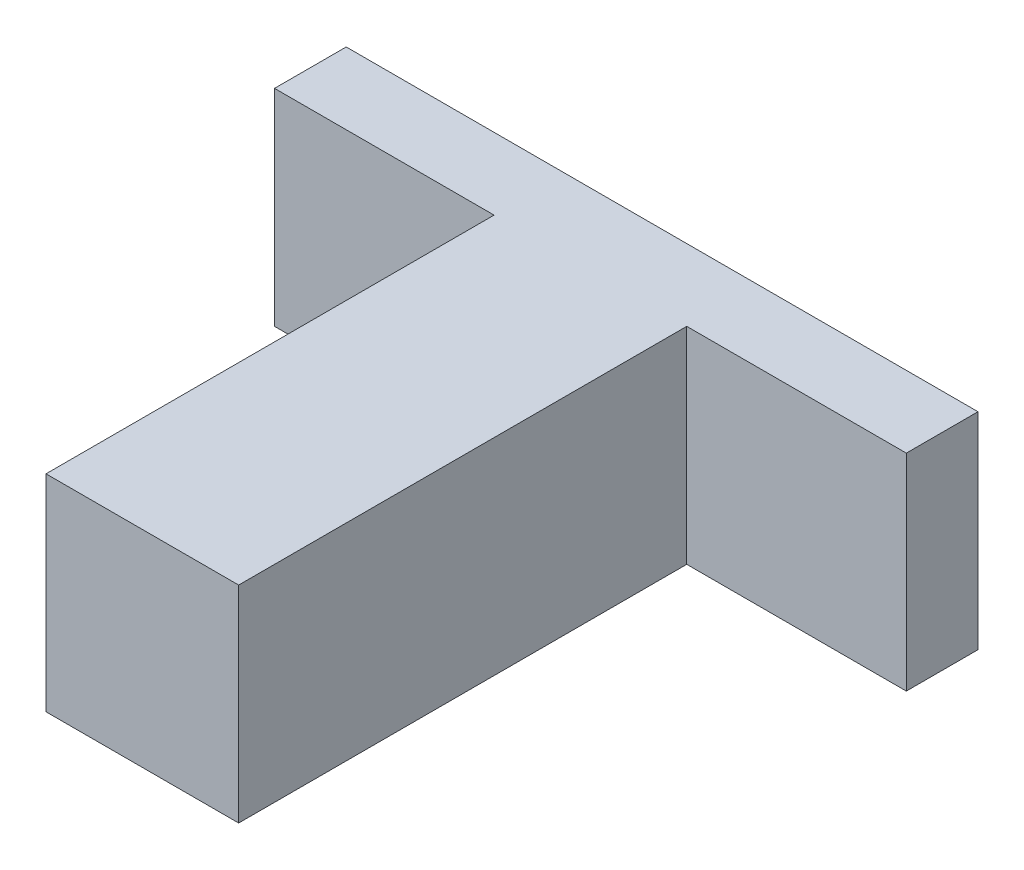
ISO-10303-21;
HEADER;
FILE_DESCRIPTION(('STEP AP214'),'2;1');
FILE_NAME('part.step','',(''),(''),'','','');
FILE_SCHEMA(('AUTOMOTIVE_DESIGN { 1 0 10303 214 1 1 1 1 }'));
ENDSEC;
DATA;
#1=APPLICATION_CONTEXT('core data for automotive mechanical design processes');
#2=APPLICATION_PROTOCOL_DEFINITION('international standard','automotive_design',2000,#1);
#3=PRODUCT_CONTEXT('',#1,'mechanical');
#4=PRODUCT('Part','Part','',(#3));
#5=PRODUCT_RELATED_PRODUCT_CATEGORY('part','',(#4));
#6=PRODUCT_DEFINITION_FORMATION('','',#4);
#7=PRODUCT_DEFINITION_CONTEXT('part definition',#1,'design');
#8=PRODUCT_DEFINITION('design','',#6,#7);
#9=PRODUCT_DEFINITION_SHAPE('','',#8);
#10=(LENGTH_UNIT() NAMED_UNIT(*) SI_UNIT(.MILLI.,.METRE.));
#11=(NAMED_UNIT(*) PLANE_ANGLE_UNIT() SI_UNIT($,.RADIAN.));
#12=(NAMED_UNIT(*) SI_UNIT($,.STERADIAN.) SOLID_ANGLE_UNIT());
#13=UNCERTAINTY_MEASURE_WITH_UNIT(LENGTH_MEASURE(1.E-05),#10,'distance_accuracy_value','');
#14=(GEOMETRIC_REPRESENTATION_CONTEXT(3) GLOBAL_UNCERTAINTY_ASSIGNED_CONTEXT((#13)) GLOBAL_UNIT_ASSIGNED_CONTEXT((#10,
#11,#12)) REPRESENTATION_CONTEXT('',''));
#15=CARTESIAN_POINT('',(0.,0.,0.));
#16=DIRECTION('',(0.,0.,1.));
#17=DIRECTION('',(1.,0.,0.));
#18=AXIS2_PLACEMENT_3D('',#15,#16,#17);
#19=CARTESIAN_POINT('',(0.,4.6,1.6));
#20=DIRECTION('',(1.,0.,0.));
#21=DIRECTION('',(0.,0.,-1.));
#22=AXIS2_PLACEMENT_3D('',#19,#20,#21);
#23=PLANE('',#22);
#24=DIRECTION('',(0.,0.,1.));
#25=VECTOR('',#24,1.);
#26=CARTESIAN_POINT('',(0.,0.,1.6));
#27=LINE('',#26,#25);
#28=CARTESIAN_POINT('',(0.,0.,0.));
#29=VERTEX_POINT('',#28);
#30=CARTESIAN_POINT('',(0.,0.,1.6));
#31=VERTEX_POINT('',#30);
#32=EDGE_CURVE('E141',#29,#31,#27,.T.);
#33=ORIENTED_EDGE('',*,*,#32,.T.);
#34=DIRECTION('',(0.,-1.,0.));
#35=VECTOR('',#34,1.);
#36=CARTESIAN_POINT('',(0.,4.6,1.6));
#37=LINE('',#36,#35);
#38=CARTESIAN_POINT('',(0.,4.6,1.6));
#39=VERTEX_POINT('',#38);
#40=EDGE_CURVE('E11',#39,#31,#37,.T.);
#41=ORIENTED_EDGE('',*,*,#40,.F.);
#42=DIRECTION('',(0.,0.,1.));
#43=VECTOR('',#42,1.);
#44=CARTESIAN_POINT('',(0.,4.6,1.6));
#45=LINE('',#44,#43);
#46=CARTESIAN_POINT('',(0.,4.6,0.));
#47=VERTEX_POINT('',#46);
#48=EDGE_CURVE('E155',#47,#39,#45,.T.);
#49=ORIENTED_EDGE('',*,*,#48,.F.);
#50=DIRECTION('',(0.,-1.,0.));
#51=VECTOR('',#50,1.);
#52=CARTESIAN_POINT('',(0.,4.6,0.));
#53=LINE('',#52,#51);
#54=EDGE_CURVE('E137',#47,#29,#53,.T.);
#55=ORIENTED_EDGE('',*,*,#54,.T.);
#56=EDGE_LOOP('',(#33,#41,#49,#55));
#57=FACE_BOUND('',#56,.T.);
#58=ADVANCED_FACE('F45',(#57),#23,.F.);
#59=CARTESIAN_POINT('',(4.9,4.6,1.6));
#60=DIRECTION('',(0.,0.,-1.));
#61=DIRECTION('',(-1.,0.,0.));
#62=AXIS2_PLACEMENT_3D('',#59,#60,#61);
#63=PLANE('',#62);
#64=DIRECTION('',(1.,0.,0.));
#65=VECTOR('',#64,1.);
#66=CARTESIAN_POINT('',(4.9,0.,1.6));
#67=LINE('',#66,#65);
#68=CARTESIAN_POINT('',(4.9,0.,1.6));
#69=VERTEX_POINT('',#68);
#70=EDGE_CURVE('E144',#31,#69,#67,.T.);
#71=ORIENTED_EDGE('',*,*,#70,.T.);
#72=DIRECTION('',(0.,-1.,0.));
#73=VECTOR('',#72,1.);
#74=CARTESIAN_POINT('',(4.9,4.6,1.6));
#75=LINE('',#74,#73);
#76=CARTESIAN_POINT('',(4.9,4.6,1.6));
#77=VERTEX_POINT('',#76);
#78=EDGE_CURVE('E53',#77,#69,#75,.T.);
#79=ORIENTED_EDGE('',*,*,#78,.F.);
#80=DIRECTION('',(1.,0.,0.));
#81=VECTOR('',#80,1.);
#82=CARTESIAN_POINT('',(4.9,4.6,1.6));
#83=LINE('',#82,#81);
#84=EDGE_CURVE('E104',#39,#77,#83,.T.);
#85=ORIENTED_EDGE('',*,*,#84,.F.);
#86=ORIENTED_EDGE('',*,*,#40,.T.);
#87=EDGE_LOOP('',(#71,#79,#85,#86));
#88=FACE_BOUND('',#87,.T.);
#89=ADVANCED_FACE('F190',(#88),#63,.F.);
#90=CARTESIAN_POINT('',(4.9,4.6,11.6));
#91=DIRECTION('',(1.,0.,0.));
#92=DIRECTION('',(0.,0.,-1.));
#93=AXIS2_PLACEMENT_3D('',#90,#91,#92);
#94=PLANE('',#93);
#95=DIRECTION('',(0.,0.,1.));
#96=VECTOR('',#95,1.);
#97=CARTESIAN_POINT('',(4.9,0.,11.6));
#98=LINE('',#97,#96);
#99=CARTESIAN_POINT('',(4.9,0.,11.6));
#100=VERTEX_POINT('',#99);
#101=EDGE_CURVE('E146',#69,#100,#98,.T.);
#102=ORIENTED_EDGE('',*,*,#101,.T.);
#103=DIRECTION('',(0.,-1.,0.));
#104=VECTOR('',#103,1.);
#105=CARTESIAN_POINT('',(4.9,4.6,11.6));
#106=LINE('',#105,#104);
#107=CARTESIAN_POINT('',(4.9,4.6,11.6));
#108=VERTEX_POINT('',#107);
#109=EDGE_CURVE('E162',#108,#100,#106,.T.);
#110=ORIENTED_EDGE('',*,*,#109,.F.);
#111=DIRECTION('',(0.,0.,1.));
#112=VECTOR('',#111,1.);
#113=CARTESIAN_POINT('',(4.9,4.6,11.6));
#114=LINE('',#113,#112);
#115=EDGE_CURVE('E170',#77,#108,#114,.T.);
#116=ORIENTED_EDGE('',*,*,#115,.F.);
#117=ORIENTED_EDGE('',*,*,#78,.T.);
#118=EDGE_LOOP('',(#102,#110,#116,#117));
#119=FACE_BOUND('',#118,.T.);
#120=ADVANCED_FACE('F168',(#119),#94,.F.);
#121=CARTESIAN_POINT('',(9.2,4.6,11.6));
#122=DIRECTION('',(0.,0.,-1.));
#123=DIRECTION('',(-1.,0.,0.));
#124=AXIS2_PLACEMENT_3D('',#121,#122,#123);
#125=PLANE('',#124);
#126=DIRECTION('',(1.,0.,0.));
#127=VECTOR('',#126,1.);
#128=CARTESIAN_POINT('',(9.2,0.,11.6));
#129=LINE('',#128,#127);
#130=CARTESIAN_POINT('',(9.2,0.,11.6));
#131=VERTEX_POINT('',#130);
#132=EDGE_CURVE('E148',#100,#131,#129,.T.);
#133=ORIENTED_EDGE('',*,*,#132,.T.);
#134=DIRECTION('',(0.,-1.,0.));
#135=VECTOR('',#134,1.);
#136=CARTESIAN_POINT('',(9.2,4.6,11.6));
#137=LINE('',#136,#135);
#138=CARTESIAN_POINT('',(9.2,4.6,11.6));
#139=VERTEX_POINT('',#138);
#140=EDGE_CURVE('E159',#139,#131,#137,.T.);
#141=ORIENTED_EDGE('',*,*,#140,.F.);
#142=DIRECTION('',(1.,0.,0.));
#143=VECTOR('',#142,1.);
#144=CARTESIAN_POINT('',(9.2,4.6,11.6));
#145=LINE('',#144,#143);
#146=EDGE_CURVE('E182',#108,#139,#145,.T.);
#147=ORIENTED_EDGE('',*,*,#146,.F.);
#148=ORIENTED_EDGE('',*,*,#109,.T.);
#149=EDGE_LOOP('',(#133,#141,#147,#148));
#150=FACE_BOUND('',#149,.T.);
#151=ADVANCED_FACE('F178',(#150),#125,.F.);
#152=CARTESIAN_POINT('',(9.2,4.6,1.6));
#153=DIRECTION('',(-1.,0.,0.));
#154=DIRECTION('',(0.,0.,1.));
#155=AXIS2_PLACEMENT_3D('',#152,#153,#154);
#156=PLANE('',#155);
#157=DIRECTION('',(0.,0.,-1.));
#158=VECTOR('',#157,1.);
#159=CARTESIAN_POINT('',(9.2,0.,1.6));
#160=LINE('',#159,#158);
#161=CARTESIAN_POINT('',(9.2,0.,1.6));
#162=VERTEX_POINT('',#161);
#163=EDGE_CURVE('E150',#131,#162,#160,.T.);
#164=ORIENTED_EDGE('',*,*,#163,.T.);
#165=DIRECTION('',(0.,-1.,0.));
#166=VECTOR('',#165,1.);
#167=CARTESIAN_POINT('',(9.2,4.6,1.6));
#168=LINE('',#167,#166);
#169=CARTESIAN_POINT('',(9.2,4.6,1.6));
#170=VERTEX_POINT('',#169);
#171=EDGE_CURVE('E132',#170,#162,#168,.T.);
#172=ORIENTED_EDGE('',*,*,#171,.F.);
#173=DIRECTION('',(0.,0.,-1.));
#174=VECTOR('',#173,1.);
#175=CARTESIAN_POINT('',(9.2,4.6,1.6));
#176=LINE('',#175,#174);
#177=EDGE_CURVE('E123',#139,#170,#176,.T.);
#178=ORIENTED_EDGE('',*,*,#177,.F.);
#179=ORIENTED_EDGE('',*,*,#140,.T.);
#180=EDGE_LOOP('',(#164,#172,#178,#179));
#181=FACE_BOUND('',#180,.T.);
#182=ADVANCED_FACE('F181',(#181),#156,.F.);
#183=CARTESIAN_POINT('',(14.1,4.6,1.6));
#184=DIRECTION('',(0.,0.,-1.));
#185=DIRECTION('',(-1.,0.,0.));
#186=AXIS2_PLACEMENT_3D('',#183,#184,#185);
#187=PLANE('',#186);
#188=DIRECTION('',(1.,0.,0.));
#189=VECTOR('',#188,1.);
#190=CARTESIAN_POINT('',(14.1,0.,1.6));
#191=LINE('',#190,#189);
#192=CARTESIAN_POINT('',(14.1,0.,1.6));
#193=VERTEX_POINT('',#192);
#194=EDGE_CURVE('E131',#162,#193,#191,.T.);
#195=ORIENTED_EDGE('',*,*,#194,.T.);
#196=DIRECTION('',(0.,-1.,0.));
#197=VECTOR('',#196,1.);
#198=CARTESIAN_POINT('',(14.1,4.6,1.6));
#199=LINE('',#198,#197);
#200=CARTESIAN_POINT('',(14.1,4.6,1.6));
#201=VERTEX_POINT('',#200);
#202=EDGE_CURVE('E128',#201,#193,#199,.T.);
#203=ORIENTED_EDGE('',*,*,#202,.F.);
#204=DIRECTION('',(1.,0.,0.));
#205=VECTOR('',#204,1.);
#206=CARTESIAN_POINT('',(14.1,4.6,1.6));
#207=LINE('',#206,#205);
#208=EDGE_CURVE('E117',#170,#201,#207,.T.);
#209=ORIENTED_EDGE('',*,*,#208,.F.);
#210=ORIENTED_EDGE('',*,*,#171,.T.);
#211=EDGE_LOOP('',(#195,#203,#209,#210));
#212=FACE_BOUND('',#211,.T.);
#213=ADVANCED_FACE('F129',(#212),#187,.F.);
#214=CARTESIAN_POINT('',(14.1,4.6,0.));
#215=DIRECTION('',(-1.,0.,0.));
#216=DIRECTION('',(0.,0.,1.));
#217=AXIS2_PLACEMENT_3D('',#214,#215,#216);
#218=PLANE('',#217);
#219=DIRECTION('',(0.,0.,-1.));
#220=VECTOR('',#219,1.);
#221=CARTESIAN_POINT('',(14.1,0.,0.));
#222=LINE('',#221,#220);
#223=CARTESIAN_POINT('',(14.1,0.,0.));
#224=VERTEX_POINT('',#223);
#225=EDGE_CURVE('E90',#193,#224,#222,.T.);
#226=ORIENTED_EDGE('',*,*,#225,.T.);
#227=DIRECTION('',(0.,-1.,0.));
#228=VECTOR('',#227,1.);
#229=CARTESIAN_POINT('',(14.1,4.6,0.));
#230=LINE('',#229,#228);
#231=CARTESIAN_POINT('',(14.1,4.6,0.));
#232=VERTEX_POINT('',#231);
#233=EDGE_CURVE('E133',#232,#224,#230,.T.);
#234=ORIENTED_EDGE('',*,*,#233,.F.);
#235=DIRECTION('',(0.,0.,-1.));
#236=VECTOR('',#235,1.);
#237=CARTESIAN_POINT('',(14.1,4.6,0.));
#238=LINE('',#237,#236);
#239=EDGE_CURVE('E121',#201,#232,#238,.T.);
#240=ORIENTED_EDGE('',*,*,#239,.F.);
#241=ORIENTED_EDGE('',*,*,#202,.T.);
#242=EDGE_LOOP('',(#226,#234,#240,#241));
#243=FACE_BOUND('',#242,.T.);
#244=ADVANCED_FACE('F135',(#243),#218,.F.);
#245=CARTESIAN_POINT('',(0.,4.6,0.));
#246=DIRECTION('',(0.,0.,1.));
#247=DIRECTION('',(1.,0.,0.));
#248=AXIS2_PLACEMENT_3D('',#245,#246,#247);
#249=PLANE('',#248);
#250=DIRECTION('',(-1.,0.,0.));
#251=VECTOR('',#250,1.);
#252=CARTESIAN_POINT('',(0.,0.,0.));
#253=LINE('',#252,#251);
#254=EDGE_CURVE('E96',#224,#29,#253,.T.);
#255=ORIENTED_EDGE('',*,*,#254,.T.);
#256=ORIENTED_EDGE('',*,*,#54,.F.);
#257=DIRECTION('',(-1.,0.,0.));
#258=VECTOR('',#257,1.);
#259=CARTESIAN_POINT('',(0.,4.6,0.));
#260=LINE('',#259,#258);
#261=EDGE_CURVE('E61',#232,#47,#260,.T.);
#262=ORIENTED_EDGE('',*,*,#261,.F.);
#263=ORIENTED_EDGE('',*,*,#233,.T.);
#264=EDGE_LOOP('',(#255,#256,#262,#263));
#265=FACE_BOUND('',#264,.T.);
#266=ADVANCED_FACE('F206',(#265),#249,.F.);
#267=CARTESIAN_POINT('',(0.,4.6,0.));
#268=DIRECTION('',(0.,-1.,0.));
#269=DIRECTION('',(0.,0.,-1.));
#270=AXIS2_PLACEMENT_3D('',#267,#268,#269);
#271=PLANE('',#270);
#272=ORIENTED_EDGE('',*,*,#48,.T.);
#273=ORIENTED_EDGE('',*,*,#84,.T.);
#274=ORIENTED_EDGE('',*,*,#115,.T.);
#275=ORIENTED_EDGE('',*,*,#146,.T.);
#276=ORIENTED_EDGE('',*,*,#177,.T.);
#277=ORIENTED_EDGE('',*,*,#208,.T.);
#278=ORIENTED_EDGE('',*,*,#239,.T.);
#279=ORIENTED_EDGE('',*,*,#261,.T.);
#280=EDGE_LOOP('',(#272,#273,#274,#275,#276,#277,#278,#279));
#281=FACE_BOUND('',#280,.T.);
#282=ADVANCED_FACE('F119',(#281),#271,.F.);
#283=CARTESIAN_POINT('',(0.,0.,0.));
#284=DIRECTION('',(0.,-1.,0.));
#285=DIRECTION('',(0.,0.,-1.));
#286=AXIS2_PLACEMENT_3D('',#283,#284,#285);
#287=PLANE('',#286);
#288=ORIENTED_EDGE('',*,*,#32,.F.);
#289=ORIENTED_EDGE('',*,*,#254,.F.);
#290=ORIENTED_EDGE('',*,*,#225,.F.);
#291=ORIENTED_EDGE('',*,*,#194,.F.);
#292=ORIENTED_EDGE('',*,*,#163,.F.);
#293=ORIENTED_EDGE('',*,*,#132,.F.);
#294=ORIENTED_EDGE('',*,*,#101,.F.);
#295=ORIENTED_EDGE('',*,*,#70,.F.);
#296=EDGE_LOOP('',(#288,#289,#290,#291,#292,#293,#294,#295));
#297=FACE_BOUND('',#296,.T.);
#298=ADVANCED_FACE('F174',(#297),#287,.T.);
#299=CLOSED_SHELL('',(#58,#89,#120,#151,#182,#213,#244,#266,#282,#298));
#300=MANIFOLD_SOLID_BREP('B2',#299);
#301=ADVANCED_BREP_SHAPE_REPRESENTATION('',(#18,#300),#14);
#302=SHAPE_DEFINITION_REPRESENTATION(#9,#301);
ENDSEC;
END-ISO-10303-21;
